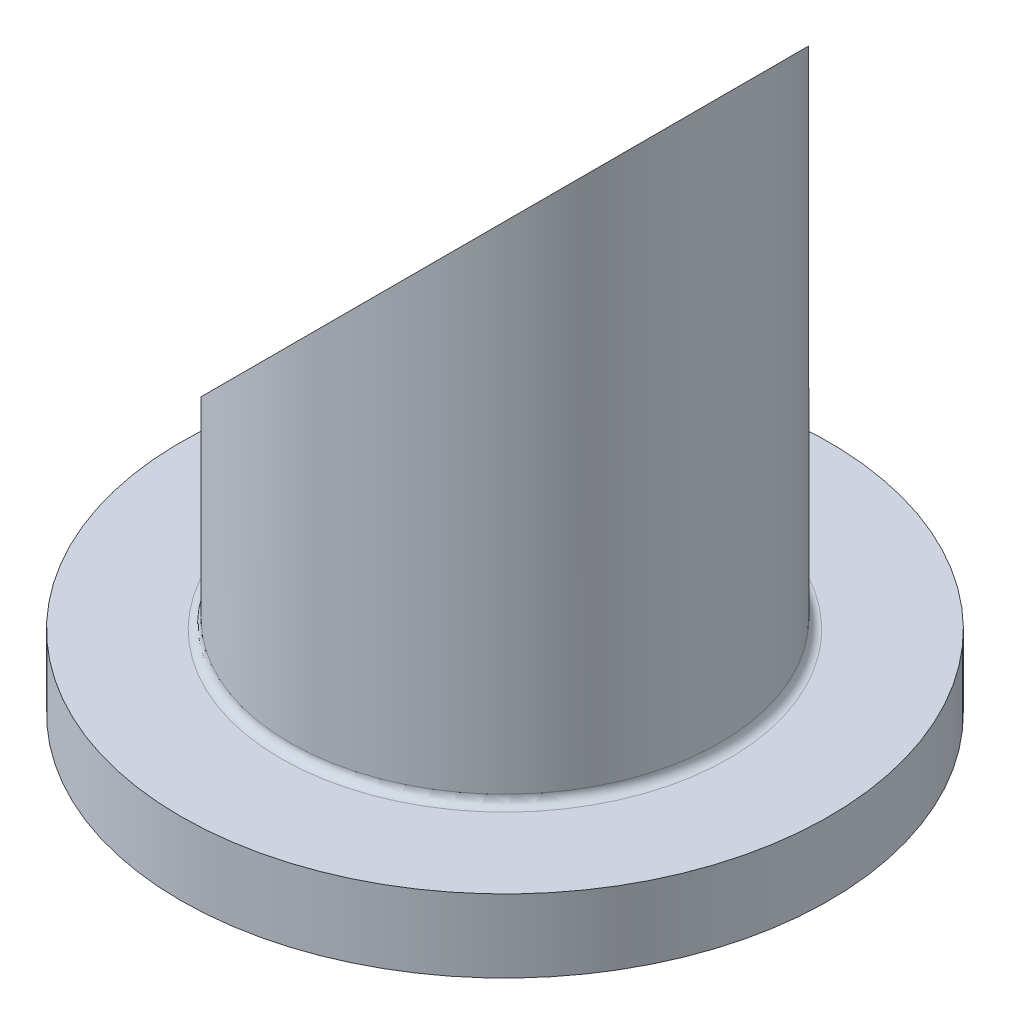
ISO-10303-21;
HEADER;
FILE_DESCRIPTION(('STEP AP214'),'2;1');
FILE_NAME('part.step','',(''),(''),'','','');
FILE_SCHEMA(('AUTOMOTIVE_DESIGN { 1 0 10303 214 1 1 1 1 }'));
ENDSEC;
DATA;
#1=APPLICATION_CONTEXT('core data for automotive mechanical design processes');
#2=APPLICATION_PROTOCOL_DEFINITION('international standard','automotive_design',2000,#1);
#3=PRODUCT_CONTEXT('',#1,'mechanical');
#4=PRODUCT('Part','Part','',(#3));
#5=PRODUCT_RELATED_PRODUCT_CATEGORY('part','',(#4));
#6=PRODUCT_DEFINITION_FORMATION('','',#4);
#7=PRODUCT_DEFINITION_CONTEXT('part definition',#1,'design');
#8=PRODUCT_DEFINITION('design','',#6,#7);
#9=PRODUCT_DEFINITION_SHAPE('','',#8);
#10=(LENGTH_UNIT() NAMED_UNIT(*) SI_UNIT(.MILLI.,.METRE.));
#11=(NAMED_UNIT(*) PLANE_ANGLE_UNIT() SI_UNIT($,.RADIAN.));
#12=(NAMED_UNIT(*) SI_UNIT($,.STERADIAN.) SOLID_ANGLE_UNIT());
#13=UNCERTAINTY_MEASURE_WITH_UNIT(LENGTH_MEASURE(1.E-05),#10,'distance_accuracy_value','');
#14=(GEOMETRIC_REPRESENTATION_CONTEXT(3) GLOBAL_UNCERTAINTY_ASSIGNED_CONTEXT((#13)) GLOBAL_UNIT_ASSIGNED_CONTEXT((#10,
#11,#12)) REPRESENTATION_CONTEXT('',''));
#15=CARTESIAN_POINT('',(0.,0.,0.));
#16=DIRECTION('',(0.,0.,1.));
#17=DIRECTION('',(1.,0.,0.));
#18=AXIS2_PLACEMENT_3D('',#15,#16,#17);
#19=CARTESIAN_POINT('',(0.,0.,0.));
#20=DIRECTION('',(0.,1.,0.));
#21=DIRECTION('',(0.,0.,1.));
#22=AXIS2_PLACEMENT_3D('',#19,#20,#21);
#23=PLANE('',#22);
#24=CARTESIAN_POINT('',(0.,0.,0.));
#25=DIRECTION('',(0.,1.,0.));
#26=DIRECTION('',(0.,0.,1.));
#27=AXIS2_PLACEMENT_3D('',#24,#25,#26);
#28=CIRCLE('',#27,8.90000000000001);
#29=CARTESIAN_POINT('',(0.,0.,8.90000000000001));
#30=VERTEX_POINT('',#29);
#31=EDGE_CURVE('E447',#30,#30,#28,.T.);
#32=ORIENTED_EDGE('',*,*,#31,.F.);
#33=EDGE_LOOP('',(#32));
#34=FACE_BOUND('',#33,.T.);
#35=CARTESIAN_POINT('',(4.75,0.,-0.25));
#36=DIRECTION('',(0.,1.,0.));
#37=DIRECTION('',(0.,0.,1.));
#38=AXIS2_PLACEMENT_3D('',#35,#36,#37);
#39=CIRCLE('',#38,0.5);
#40=CARTESIAN_POINT('',(4.75,0.,-0.75));
#41=VERTEX_POINT('',#40);
#42=CARTESIAN_POINT('',(5.25,0.,-0.25));
#43=VERTEX_POINT('',#42);
#44=EDGE_CURVE('E192',#41,#43,#39,.F.);
#45=ORIENTED_EDGE('',*,*,#44,.F.);
#46=DIRECTION('',(1.,0.,0.));
#47=VECTOR('',#46,1.);
#48=CARTESIAN_POINT('',(0.,0.,-0.75));
#49=LINE('',#48,#47);
#50=CARTESIAN_POINT('',(3.25,0.,-0.75));
#51=VERTEX_POINT('',#50);
#52=EDGE_CURVE('E142',#41,#51,#49,.F.);
#53=ORIENTED_EDGE('',*,*,#52,.T.);
#54=CARTESIAN_POINT('',(3.25,0.,-0.25));
#55=DIRECTION('',(0.,1.,0.));
#56=DIRECTION('',(0.,0.,1.));
#57=AXIS2_PLACEMENT_3D('',#54,#55,#56);
#58=CIRCLE('',#57,0.5);
#59=CARTESIAN_POINT('',(2.75,0.,-0.25));
#60=VERTEX_POINT('',#59);
#61=EDGE_CURVE('E188',#60,#51,#58,.F.);
#62=ORIENTED_EDGE('',*,*,#61,.F.);
#63=DIRECTION('',(0.,0.,-1.));
#64=VECTOR('',#63,1.);
#65=CARTESIAN_POINT('',(2.75,0.,0.));
#66=LINE('',#65,#64);
#67=CARTESIAN_POINT('',(2.75,0.,0.25));
#68=VERTEX_POINT('',#67);
#69=EDGE_CURVE('E184',#60,#68,#66,.F.);
#70=ORIENTED_EDGE('',*,*,#69,.T.);
#71=CARTESIAN_POINT('',(3.25,0.,0.25));
#72=DIRECTION('',(0.,1.,0.));
#73=DIRECTION('',(0.,0.,1.));
#74=AXIS2_PLACEMENT_3D('',#71,#72,#73);
#75=CIRCLE('',#74,0.5);
#76=CARTESIAN_POINT('',(3.25,0.,0.75));
#77=VERTEX_POINT('',#76);
#78=EDGE_CURVE('E181',#77,#68,#75,.F.);
#79=ORIENTED_EDGE('',*,*,#78,.F.);
#80=DIRECTION('',(-1.,0.,0.));
#81=VECTOR('',#80,1.);
#82=CARTESIAN_POINT('',(0.,0.,0.75));
#83=LINE('',#82,#81);
#84=CARTESIAN_POINT('',(4.75,0.,0.75));
#85=VERTEX_POINT('',#84);
#86=EDGE_CURVE('E179',#77,#85,#83,.F.);
#87=ORIENTED_EDGE('',*,*,#86,.T.);
#88=CARTESIAN_POINT('',(4.75,0.,0.25));
#89=DIRECTION('',(0.,1.,0.));
#90=DIRECTION('',(0.,0.,1.));
#91=AXIS2_PLACEMENT_3D('',#88,#89,#90);
#92=CIRCLE('',#91,0.5);
#93=CARTESIAN_POINT('',(5.25,0.,0.25));
#94=VERTEX_POINT('',#93);
#95=EDGE_CURVE('E173',#94,#85,#92,.F.);
#96=ORIENTED_EDGE('',*,*,#95,.F.);
#97=DIRECTION('',(0.,0.,1.));
#98=VECTOR('',#97,1.);
#99=CARTESIAN_POINT('',(5.25,0.,0.));
#100=LINE('',#99,#98);
#101=EDGE_CURVE('E186',#94,#43,#100,.F.);
#102=ORIENTED_EDGE('',*,*,#101,.T.);
#103=EDGE_LOOP('',(#45,#53,#62,#70,#79,#87,#96,#102));
#104=FACE_BOUND('',#103,.T.);
#105=ADVANCED_FACE('F35',(#34,#104),#23,.F.);
#106=CARTESIAN_POINT('',(0.,2.,0.));
#107=DIRECTION('',(0.,-1.,0.));
#108=DIRECTION('',(0.,0.,-1.));
#109=AXIS2_PLACEMENT_3D('',#106,#107,#108);
#110=CYLINDRICAL_SURFACE('',#109,8.90000000000001);
#111=CARTESIAN_POINT('',(0.,2.,0.));
#112=DIRECTION('',(0.,1.,0.));
#113=DIRECTION('',(0.,0.,1.));
#114=AXIS2_PLACEMENT_3D('',#111,#112,#113);
#115=CIRCLE('',#114,8.90000000000001);
#116=CARTESIAN_POINT('',(0.,2.,8.90000000000001));
#117=VERTEX_POINT('',#116);
#118=EDGE_CURVE('E166',#117,#117,#115,.T.);
#119=ORIENTED_EDGE('',*,*,#118,.F.);
#120=EDGE_LOOP('',(#119));
#121=FACE_BOUND('',#120,.T.);
#122=ORIENTED_EDGE('',*,*,#31,.T.);
#123=EDGE_LOOP('',(#122));
#124=FACE_BOUND('',#123,.T.);
#125=ADVANCED_FACE('F298',(#121,#124),#110,.T.);
#126=CARTESIAN_POINT('',(0.,2.,0.));
#127=DIRECTION('',(0.,1.,0.));
#128=DIRECTION('',(0.,0.,1.));
#129=AXIS2_PLACEMENT_3D('',#126,#127,#128);
#130=PLANE('',#129);
#131=CARTESIAN_POINT('',(0.,2.,0.));
#132=DIRECTION('',(0.,1.,0.));
#133=DIRECTION('',(0.,0.,1.));
#134=AXIS2_PLACEMENT_3D('',#131,#132,#133);
#135=CIRCLE('',#134,6.15);
#136=CARTESIAN_POINT('',(0.,2.,6.15));
#137=VERTEX_POINT('',#136);
#138=EDGE_CURVE('E11',#137,#137,#135,.F.);
#139=ORIENTED_EDGE('',*,*,#138,.T.);
#140=EDGE_LOOP('',(#139));
#141=FACE_BOUND('',#140,.T.);
#142=ORIENTED_EDGE('',*,*,#118,.T.);
#143=EDGE_LOOP('',(#142));
#144=FACE_BOUND('',#143,.T.);
#145=ADVANCED_FACE('F304',(#141,#144),#130,.T.);
#146=CARTESIAN_POINT('',(0.,22.,0.));
#147=DIRECTION('',(0.,-1.,0.));
#148=DIRECTION('',(0.,0.,-1.));
#149=AXIS2_PLACEMENT_3D('',#146,#147,#148);
#150=CYLINDRICAL_SURFACE('',#149,5.9);
#151=CARTESIAN_POINT('',(0.,2.25,0.));
#152=DIRECTION('',(0.,1.,0.));
#153=DIRECTION('',(0.,0.,1.));
#154=AXIS2_PLACEMENT_3D('',#151,#152,#153);
#155=CIRCLE('',#154,5.9);
#156=CARTESIAN_POINT('',(0.,2.25,5.9));
#157=VERTEX_POINT('',#156);
#158=EDGE_CURVE('E43',#157,#157,#155,.T.);
#159=ORIENTED_EDGE('',*,*,#158,.T.);
#160=EDGE_LOOP('',(#159));
#161=FACE_BOUND('',#160,.T.);
#162=CARTESIAN_POINT('',(0.,11.7,0.));
#163=DIRECTION('',(0.707106781186548,-0.707106781186547,0.));
#164=DIRECTION('',(-0.707106781186547,-0.707106781186548,0.));
#165=AXIS2_PLACEMENT_3D('',#162,#163,#164);
#166=ELLIPSE('',#165,8.34386001800126,5.9);
#167=CARTESIAN_POINT('',(-5.9,5.79999999999999,0.));
#168=VERTEX_POINT('',#167);
#169=EDGE_CURVE('E283',#168,#168,#166,.T.);
#170=ORIENTED_EDGE('',*,*,#169,.T.);
#171=EDGE_LOOP('',(#170));
#172=FACE_BOUND('',#171,.T.);
#173=ADVANCED_FACE('F287',(#161,#172),#150,.T.);
#174=CARTESIAN_POINT('',(-5.85,5.85,-8.90000000000001));
#175=DIRECTION('',(0.707106781186548,-0.707106781186547,0.));
#176=DIRECTION('',(0.707106781186547,0.707106781186548,0.));
#177=AXIS2_PLACEMENT_3D('',#174,#175,#176);
#178=PLANE('',#177);
#179=ORIENTED_EDGE('',*,*,#169,.F.);
#180=EDGE_LOOP('',(#179));
#181=FACE_BOUND('',#180,.T.);
#182=ADVANCED_FACE('F426',(#181),#178,.F.);
#183=CARTESIAN_POINT('',(3.,1.2,0.5));
#184=DIRECTION('',(-1.,0.,0.));
#185=DIRECTION('',(0.,0.,1.));
#186=AXIS2_PLACEMENT_3D('',#183,#184,#185);
#187=PLANE('',#186);
#188=DIRECTION('',(0.,0.,-1.));
#189=VECTOR('',#188,1.);
#190=CARTESIAN_POINT('',(3.,0.25,0.5));
#191=LINE('',#190,#189);
#192=CARTESIAN_POINT('',(3.,0.25,0.25));
#193=VERTEX_POINT('',#192);
#194=CARTESIAN_POINT('',(3.,0.25,-0.25));
#195=VERTEX_POINT('',#194);
#196=EDGE_CURVE('E207',#193,#195,#191,.T.);
#197=ORIENTED_EDGE('',*,*,#196,.T.);
#198=DIRECTION('',(0.,-1.,0.));
#199=VECTOR('',#198,1.);
#200=CARTESIAN_POINT('',(3.,1.2,-0.25));
#201=LINE('',#200,#199);
#202=CARTESIAN_POINT('',(3.,0.95,-0.25));
#203=VERTEX_POINT('',#202);
#204=EDGE_CURVE('E210',#195,#203,#201,.F.);
#205=ORIENTED_EDGE('',*,*,#204,.T.);
#206=DIRECTION('',(0.,0.,-1.));
#207=VECTOR('',#206,1.);
#208=CARTESIAN_POINT('',(3.,0.95,0.5));
#209=LINE('',#208,#207);
#210=CARTESIAN_POINT('',(3.,0.95,0.25));
#211=VERTEX_POINT('',#210);
#212=EDGE_CURVE('E205',#203,#211,#209,.F.);
#213=ORIENTED_EDGE('',*,*,#212,.T.);
#214=DIRECTION('',(0.,-1.,0.));
#215=VECTOR('',#214,1.);
#216=CARTESIAN_POINT('',(3.,0.,0.25));
#217=LINE('',#216,#215);
#218=EDGE_CURVE('E203',#211,#193,#217,.T.);
#219=ORIENTED_EDGE('',*,*,#218,.T.);
#220=EDGE_LOOP('',(#197,#205,#213,#219));
#221=FACE_BOUND('',#220,.T.);
#222=ADVANCED_FACE('F424',(#221),#187,.F.);
#223=CARTESIAN_POINT('',(3.,1.2,0.5));
#224=DIRECTION('',(0.,0.,1.));
#225=DIRECTION('',(1.,0.,0.));
#226=AXIS2_PLACEMENT_3D('',#223,#224,#225);
#227=PLANE('',#226);
#228=DIRECTION('',(-1.,0.,0.));
#229=VECTOR('',#228,1.);
#230=CARTESIAN_POINT('',(3.,0.25,0.5));
#231=LINE('',#230,#229);
#232=CARTESIAN_POINT('',(4.75,0.25,0.5));
#233=VERTEX_POINT('',#232);
#234=CARTESIAN_POINT('',(3.25,0.25,0.5));
#235=VERTEX_POINT('',#234);
#236=EDGE_CURVE('E55',#233,#235,#231,.T.);
#237=ORIENTED_EDGE('',*,*,#236,.T.);
#238=DIRECTION('',(0.,-1.,0.));
#239=VECTOR('',#238,1.);
#240=CARTESIAN_POINT('',(3.25,1.2,0.5));
#241=LINE('',#240,#239);
#242=CARTESIAN_POINT('',(3.25,0.95,0.5));
#243=VERTEX_POINT('',#242);
#244=EDGE_CURVE('E50',#235,#243,#241,.F.);
#245=ORIENTED_EDGE('',*,*,#244,.T.);
#246=DIRECTION('',(-1.,0.,0.));
#247=VECTOR('',#246,1.);
#248=CARTESIAN_POINT('',(3.,0.95,0.5));
#249=LINE('',#248,#247);
#250=CARTESIAN_POINT('',(4.75,0.95,0.5));
#251=VERTEX_POINT('',#250);
#252=EDGE_CURVE('E224',#243,#251,#249,.F.);
#253=ORIENTED_EDGE('',*,*,#252,.T.);
#254=DIRECTION('',(0.,-1.,0.));
#255=VECTOR('',#254,1.);
#256=CARTESIAN_POINT('',(4.75,0.,0.5));
#257=LINE('',#256,#255);
#258=EDGE_CURVE('E221',#251,#233,#257,.T.);
#259=ORIENTED_EDGE('',*,*,#258,.T.);
#260=EDGE_LOOP('',(#237,#245,#253,#259));
#261=FACE_BOUND('',#260,.T.);
#262=ADVANCED_FACE('F410',(#261),#227,.F.);
#263=CARTESIAN_POINT('',(5.,1.2,0.5));
#264=DIRECTION('',(1.,0.,0.));
#265=DIRECTION('',(0.,0.,-1.));
#266=AXIS2_PLACEMENT_3D('',#263,#264,#265);
#267=PLANE('',#266);
#268=DIRECTION('',(0.,0.,1.));
#269=VECTOR('',#268,1.);
#270=CARTESIAN_POINT('',(5.,0.95,0.5));
#271=LINE('',#270,#269);
#272=CARTESIAN_POINT('',(5.,0.95,0.25));
#273=VERTEX_POINT('',#272);
#274=CARTESIAN_POINT('',(5.,0.95,-0.25));
#275=VERTEX_POINT('',#274);
#276=EDGE_CURVE('E196',#273,#275,#271,.F.);
#277=ORIENTED_EDGE('',*,*,#276,.T.);
#278=DIRECTION('',(0.,-1.,0.));
#279=VECTOR('',#278,1.);
#280=CARTESIAN_POINT('',(5.,0.,-0.25));
#281=LINE('',#280,#279);
#282=CARTESIAN_POINT('',(5.,0.25,-0.25));
#283=VERTEX_POINT('',#282);
#284=EDGE_CURVE('E201',#275,#283,#281,.T.);
#285=ORIENTED_EDGE('',*,*,#284,.T.);
#286=DIRECTION('',(0.,0.,1.));
#287=VECTOR('',#286,1.);
#288=CARTESIAN_POINT('',(5.,0.25,0.5));
#289=LINE('',#288,#287);
#290=CARTESIAN_POINT('',(5.,0.25,0.25));
#291=VERTEX_POINT('',#290);
#292=EDGE_CURVE('E198',#283,#291,#289,.T.);
#293=ORIENTED_EDGE('',*,*,#292,.T.);
#294=DIRECTION('',(0.,-1.,0.));
#295=VECTOR('',#294,1.);
#296=CARTESIAN_POINT('',(5.,1.2,0.25));
#297=LINE('',#296,#295);
#298=EDGE_CURVE('E194',#291,#273,#297,.F.);
#299=ORIENTED_EDGE('',*,*,#298,.T.);
#300=EDGE_LOOP('',(#277,#285,#293,#299));
#301=FACE_BOUND('',#300,.T.);
#302=ADVANCED_FACE('F403',(#301),#267,.F.);
#303=CARTESIAN_POINT('',(3.,1.2,-0.5));
#304=DIRECTION('',(0.,0.,-1.));
#305=DIRECTION('',(-1.,0.,0.));
#306=AXIS2_PLACEMENT_3D('',#303,#304,#305);
#307=PLANE('',#306);
#308=DIRECTION('',(1.,0.,0.));
#309=VECTOR('',#308,1.);
#310=CARTESIAN_POINT('',(3.,0.95,-0.5));
#311=LINE('',#310,#309);
#312=CARTESIAN_POINT('',(4.75,0.95,-0.5));
#313=VERTEX_POINT('',#312);
#314=CARTESIAN_POINT('',(3.25,0.95,-0.5));
#315=VERTEX_POINT('',#314);
#316=EDGE_CURVE('E165',#313,#315,#311,.F.);
#317=ORIENTED_EDGE('',*,*,#316,.T.);
#318=DIRECTION('',(0.,-1.,0.));
#319=VECTOR('',#318,1.);
#320=CARTESIAN_POINT('',(3.25,0.,-0.5));
#321=LINE('',#320,#319);
#322=CARTESIAN_POINT('',(3.25,0.25,-0.5));
#323=VERTEX_POINT('',#322);
#324=EDGE_CURVE('E170',#315,#323,#321,.T.);
#325=ORIENTED_EDGE('',*,*,#324,.T.);
#326=DIRECTION('',(1.,0.,0.));
#327=VECTOR('',#326,1.);
#328=CARTESIAN_POINT('',(3.,0.25,-0.5));
#329=LINE('',#328,#327);
#330=CARTESIAN_POINT('',(4.75,0.25,-0.5));
#331=VERTEX_POINT('',#330);
#332=EDGE_CURVE('E140',#323,#331,#329,.T.);
#333=ORIENTED_EDGE('',*,*,#332,.T.);
#334=DIRECTION('',(0.,-1.,0.));
#335=VECTOR('',#334,1.);
#336=CARTESIAN_POINT('',(4.75,1.2,-0.5));
#337=LINE('',#336,#335);
#338=EDGE_CURVE('E159',#331,#313,#337,.F.);
#339=ORIENTED_EDGE('',*,*,#338,.T.);
#340=EDGE_LOOP('',(#317,#325,#333,#339));
#341=FACE_BOUND('',#340,.T.);
#342=ADVANCED_FACE('F168',(#341),#307,.F.);
#343=CARTESIAN_POINT('',(0.,1.2,0.));
#344=DIRECTION('',(0.,-1.,0.));
#345=DIRECTION('',(0.,0.,-1.));
#346=AXIS2_PLACEMENT_3D('',#343,#344,#345);
#347=PLANE('',#346);
#348=DIRECTION('',(0.,0.,1.));
#349=VECTOR('',#348,1.);
#350=CARTESIAN_POINT('',(4.75,1.2,0.));
#351=LINE('',#350,#349);
#352=CARTESIAN_POINT('',(4.75,1.2,-0.25));
#353=VERTEX_POINT('',#352);
#354=CARTESIAN_POINT('',(4.75,1.2,0.25));
#355=VERTEX_POINT('',#354);
#356=EDGE_CURVE('E216',#353,#355,#351,.T.);
#357=ORIENTED_EDGE('',*,*,#356,.T.);
#358=DIRECTION('',(-1.,0.,0.));
#359=VECTOR('',#358,1.);
#360=CARTESIAN_POINT('',(0.,1.2,0.25));
#361=LINE('',#360,#359);
#362=CARTESIAN_POINT('',(3.25,1.2,0.25));
#363=VERTEX_POINT('',#362);
#364=EDGE_CURVE('E218',#355,#363,#361,.T.);
#365=ORIENTED_EDGE('',*,*,#364,.T.);
#366=DIRECTION('',(0.,0.,-1.));
#367=VECTOR('',#366,1.);
#368=CARTESIAN_POINT('',(3.25,1.2,0.));
#369=LINE('',#368,#367);
#370=CARTESIAN_POINT('',(3.25,1.2,-0.25));
#371=VERTEX_POINT('',#370);
#372=EDGE_CURVE('E212',#363,#371,#369,.T.);
#373=ORIENTED_EDGE('',*,*,#372,.T.);
#374=DIRECTION('',(1.,0.,0.));
#375=VECTOR('',#374,1.);
#376=CARTESIAN_POINT('',(0.,1.2,-0.25));
#377=LINE('',#376,#375);
#378=EDGE_CURVE('E214',#371,#353,#377,.T.);
#379=ORIENTED_EDGE('',*,*,#378,.T.);
#380=EDGE_LOOP('',(#357,#365,#373,#379));
#381=FACE_BOUND('',#380,.T.);
#382=ADVANCED_FACE('F381',(#381),#347,.T.);
#383=CARTESIAN_POINT('',(0.,0.95,0.25));
#384=DIRECTION('',(-1.,0.,0.));
#385=DIRECTION('',(0.,0.,1.));
#386=AXIS2_PLACEMENT_3D('',#383,#384,#385);
#387=CYLINDRICAL_SURFACE('',#386,0.25);
#388=CARTESIAN_POINT('',(3.25,0.95,0.25));
#389=DIRECTION('',(1.,0.,0.));
#390=DIRECTION('',(0.,0.,-1.));
#391=AXIS2_PLACEMENT_3D('',#388,#389,#390);
#392=CIRCLE('',#391,0.25);
#393=EDGE_CURVE('E281',#363,#243,#392,.T.);
#394=ORIENTED_EDGE('',*,*,#393,.F.);
#395=ORIENTED_EDGE('',*,*,#364,.F.);
#396=CARTESIAN_POINT('',(4.75,0.95,0.25));
#397=DIRECTION('',(-1.,0.,0.));
#398=DIRECTION('',(0.,0.,1.));
#399=AXIS2_PLACEMENT_3D('',#396,#397,#398);
#400=CIRCLE('',#399,0.25);
#401=EDGE_CURVE('E278',#251,#355,#400,.T.);
#402=ORIENTED_EDGE('',*,*,#401,.F.);
#403=ORIENTED_EDGE('',*,*,#252,.F.);
#404=EDGE_LOOP('',(#394,#395,#402,#403));
#405=FACE_BOUND('',#404,.T.);
#406=ADVANCED_FACE('F378',(#405),#387,.F.);
#407=CARTESIAN_POINT('',(3.25,0.95,0.25));
#408=DIRECTION('',(0.,0.,1.));
#409=DIRECTION('',(1.,0.,0.));
#410=AXIS2_PLACEMENT_3D('',#407,#408,#409);
#411=SPHERICAL_SURFACE('',#410,0.25);
#412=CARTESIAN_POINT('',(3.25,0.95,0.25));
#413=DIRECTION('',(0.,0.,-1.));
#414=DIRECTION('',(-1.,0.,0.));
#415=AXIS2_PLACEMENT_3D('',#412,#413,#414);
#416=CIRCLE('',#415,0.25);
#417=EDGE_CURVE('E272',#363,#211,#416,.F.);
#418=ORIENTED_EDGE('',*,*,#417,.F.);
#419=ORIENTED_EDGE('',*,*,#393,.T.);
#420=CARTESIAN_POINT('',(3.25,0.95,0.25));
#421=DIRECTION('',(0.,-1.,0.));
#422=DIRECTION('',(0.,0.,-1.));
#423=AXIS2_PLACEMENT_3D('',#420,#421,#422);
#424=CIRCLE('',#423,0.25);
#425=EDGE_CURVE('E275',#211,#243,#424,.F.);
#426=ORIENTED_EDGE('',*,*,#425,.F.);
#427=EDGE_LOOP('',(#418,#419,#426));
#428=FACE_BOUND('',#427,.T.);
#429=ADVANCED_FACE('F375',(#428),#411,.F.);
#430=CARTESIAN_POINT('',(4.75,0.95,0.25));
#431=DIRECTION('',(0.,0.,1.));
#432=DIRECTION('',(1.,0.,0.));
#433=AXIS2_PLACEMENT_3D('',#430,#431,#432);
#434=SPHERICAL_SURFACE('',#433,0.25);
#435=CARTESIAN_POINT('',(4.75,0.95,0.25));
#436=DIRECTION('',(0.,-1.,0.));
#437=DIRECTION('',(0.,0.,-1.));
#438=AXIS2_PLACEMENT_3D('',#435,#436,#437);
#439=CIRCLE('',#438,0.25);
#440=EDGE_CURVE('E266',#251,#273,#439,.F.);
#441=ORIENTED_EDGE('',*,*,#440,.F.);
#442=ORIENTED_EDGE('',*,*,#401,.T.);
#443=CARTESIAN_POINT('',(4.75,0.95,0.25));
#444=DIRECTION('',(0.,0.,-1.));
#445=DIRECTION('',(-1.,0.,0.));
#446=AXIS2_PLACEMENT_3D('',#443,#444,#445);
#447=CIRCLE('',#446,0.25);
#448=EDGE_CURVE('E269',#273,#355,#447,.F.);
#449=ORIENTED_EDGE('',*,*,#448,.F.);
#450=EDGE_LOOP('',(#441,#442,#449));
#451=FACE_BOUND('',#450,.T.);
#452=ADVANCED_FACE('F371',(#451),#434,.F.);
#453=CARTESIAN_POINT('',(3.25,1.2,0.25));
#454=DIRECTION('',(0.,1.,0.));
#455=DIRECTION('',(0.,0.,1.));
#456=AXIS2_PLACEMENT_3D('',#453,#454,#455);
#457=CYLINDRICAL_SURFACE('',#456,0.25);
#458=ORIENTED_EDGE('',*,*,#425,.T.);
#459=ORIENTED_EDGE('',*,*,#244,.F.);
#460=CARTESIAN_POINT('',(3.25,0.25,0.25));
#461=DIRECTION('',(0.,1.,0.));
#462=DIRECTION('',(0.,0.,1.));
#463=AXIS2_PLACEMENT_3D('',#460,#461,#462);
#464=CIRCLE('',#463,0.25);
#465=EDGE_CURVE('E260',#193,#235,#464,.T.);
#466=ORIENTED_EDGE('',*,*,#465,.F.);
#467=ORIENTED_EDGE('',*,*,#218,.F.);
#468=EDGE_LOOP('',(#458,#459,#466,#467));
#469=FACE_BOUND('',#468,.T.);
#470=ADVANCED_FACE('F367',(#469),#457,.F.);
#471=CARTESIAN_POINT('',(3.25,0.95,0.));
#472=DIRECTION('',(0.,0.,-1.));
#473=DIRECTION('',(-1.,0.,0.));
#474=AXIS2_PLACEMENT_3D('',#471,#472,#473);
#475=CYLINDRICAL_SURFACE('',#474,0.25);
#476=ORIENTED_EDGE('',*,*,#417,.T.);
#477=ORIENTED_EDGE('',*,*,#212,.F.);
#478=CARTESIAN_POINT('',(3.25,0.95,-0.25));
#479=DIRECTION('',(0.,0.,1.));
#480=DIRECTION('',(1.,0.,0.));
#481=AXIS2_PLACEMENT_3D('',#478,#479,#480);
#482=CIRCLE('',#481,0.25);
#483=EDGE_CURVE('E257',#371,#203,#482,.T.);
#484=ORIENTED_EDGE('',*,*,#483,.F.);
#485=ORIENTED_EDGE('',*,*,#372,.F.);
#486=EDGE_LOOP('',(#476,#477,#484,#485));
#487=FACE_BOUND('',#486,.T.);
#488=ADVANCED_FACE('F363',(#487),#475,.F.);
#489=CARTESIAN_POINT('',(0.,0.95,-0.25));
#490=DIRECTION('',(1.,0.,0.));
#491=DIRECTION('',(0.,0.,-1.));
#492=AXIS2_PLACEMENT_3D('',#489,#490,#491);
#493=CYLINDRICAL_SURFACE('',#492,0.25);
#494=CARTESIAN_POINT('',(4.75,0.95,-0.25));
#495=DIRECTION('',(-1.,0.,0.));
#496=DIRECTION('',(0.,0.,1.));
#497=AXIS2_PLACEMENT_3D('',#494,#495,#496);
#498=CIRCLE('',#497,0.25);
#499=EDGE_CURVE('E251',#353,#313,#498,.T.);
#500=ORIENTED_EDGE('',*,*,#499,.F.);
#501=ORIENTED_EDGE('',*,*,#378,.F.);
#502=CARTESIAN_POINT('',(3.25,0.95,-0.25));
#503=DIRECTION('',(1.,0.,0.));
#504=DIRECTION('',(0.,0.,-1.));
#505=AXIS2_PLACEMENT_3D('',#502,#503,#504);
#506=CIRCLE('',#505,0.25);
#507=EDGE_CURVE('E254',#315,#371,#506,.T.);
#508=ORIENTED_EDGE('',*,*,#507,.F.);
#509=ORIENTED_EDGE('',*,*,#316,.F.);
#510=EDGE_LOOP('',(#500,#501,#508,#509));
#511=FACE_BOUND('',#510,.T.);
#512=ADVANCED_FACE('F359',(#511),#493,.F.);
#513=CARTESIAN_POINT('',(4.75,0.95,0.));
#514=DIRECTION('',(0.,0.,1.));
#515=DIRECTION('',(1.,0.,0.));
#516=AXIS2_PLACEMENT_3D('',#513,#514,#515);
#517=CYLINDRICAL_SURFACE('',#516,0.25);
#518=ORIENTED_EDGE('',*,*,#448,.T.);
#519=ORIENTED_EDGE('',*,*,#356,.F.);
#520=CARTESIAN_POINT('',(4.75,0.95,-0.25));
#521=DIRECTION('',(0.,0.,1.));
#522=DIRECTION('',(1.,0.,0.));
#523=AXIS2_PLACEMENT_3D('',#520,#521,#522);
#524=CIRCLE('',#523,0.25);
#525=EDGE_CURVE('E248',#275,#353,#524,.T.);
#526=ORIENTED_EDGE('',*,*,#525,.F.);
#527=ORIENTED_EDGE('',*,*,#276,.F.);
#528=EDGE_LOOP('',(#518,#519,#526,#527));
#529=FACE_BOUND('',#528,.T.);
#530=ADVANCED_FACE('F355',(#529),#517,.F.);
#531=CARTESIAN_POINT('',(4.75,1.2,0.25));
#532=DIRECTION('',(0.,1.,0.));
#533=DIRECTION('',(0.,0.,1.));
#534=AXIS2_PLACEMENT_3D('',#531,#532,#533);
#535=CYLINDRICAL_SURFACE('',#534,0.25);
#536=ORIENTED_EDGE('',*,*,#440,.T.);
#537=ORIENTED_EDGE('',*,*,#298,.F.);
#538=CARTESIAN_POINT('',(4.75,0.25,0.25));
#539=DIRECTION('',(0.,1.,0.));
#540=DIRECTION('',(0.,0.,1.));
#541=AXIS2_PLACEMENT_3D('',#538,#539,#540);
#542=CIRCLE('',#541,0.25);
#543=EDGE_CURVE('E245',#233,#291,#542,.T.);
#544=ORIENTED_EDGE('',*,*,#543,.F.);
#545=ORIENTED_EDGE('',*,*,#258,.F.);
#546=EDGE_LOOP('',(#536,#537,#544,#545));
#547=FACE_BOUND('',#546,.T.);
#548=ADVANCED_FACE('F351',(#547),#535,.F.);
#549=CARTESIAN_POINT('',(3.,0.25,0.75));
#550=DIRECTION('',(-1.,0.,0.));
#551=DIRECTION('',(0.,0.,1.));
#552=AXIS2_PLACEMENT_3D('',#549,#550,#551);
#553=CYLINDRICAL_SURFACE('',#552,0.25);
#554=CARTESIAN_POINT('',(4.75,0.25,0.75));
#555=DIRECTION('',(1.,0.,0.));
#556=DIRECTION('',(0.,0.,-1.));
#557=AXIS2_PLACEMENT_3D('',#554,#555,#556);
#558=CIRCLE('',#557,0.25);
#559=EDGE_CURVE('E242',#85,#233,#558,.T.);
#560=ORIENTED_EDGE('',*,*,#559,.F.);
#561=ORIENTED_EDGE('',*,*,#86,.F.);
#562=CARTESIAN_POINT('',(3.25,0.25,0.75));
#563=DIRECTION('',(-1.,0.,0.));
#564=DIRECTION('',(0.,0.,1.));
#565=AXIS2_PLACEMENT_3D('',#562,#563,#564);
#566=CIRCLE('',#565,0.25);
#567=EDGE_CURVE('E263',#235,#77,#566,.T.);
#568=ORIENTED_EDGE('',*,*,#567,.F.);
#569=ORIENTED_EDGE('',*,*,#236,.F.);
#570=EDGE_LOOP('',(#560,#561,#568,#569));
#571=FACE_BOUND('',#570,.T.);
#572=ADVANCED_FACE('F347',(#571),#553,.T.);
#573=CARTESIAN_POINT('',(3.25,0.25,0.25));
#574=DIRECTION('',(0.,1.,0.));
#575=DIRECTION('',(0.,0.,1.));
#576=AXIS2_PLACEMENT_3D('',#573,#574,#575);
#577=TOROIDAL_SURFACE('',#576,0.5,0.25);
#578=ORIENTED_EDGE('',*,*,#567,.T.);
#579=ORIENTED_EDGE('',*,*,#78,.T.);
#580=CARTESIAN_POINT('',(2.75,0.25,0.25));
#581=DIRECTION('',(0.,0.,1.));
#582=DIRECTION('',(1.,0.,0.));
#583=AXIS2_PLACEMENT_3D('',#580,#581,#582);
#584=CIRCLE('',#583,0.25);
#585=EDGE_CURVE('E239',#193,#68,#584,.F.);
#586=ORIENTED_EDGE('',*,*,#585,.F.);
#587=ORIENTED_EDGE('',*,*,#465,.T.);
#588=EDGE_LOOP('',(#578,#579,#586,#587));
#589=FACE_BOUND('',#588,.T.);
#590=ADVANCED_FACE('F343',(#589),#577,.T.);
#591=CARTESIAN_POINT('',(3.25,0.95,-0.25));
#592=DIRECTION('',(0.,0.,1.));
#593=DIRECTION('',(1.,0.,0.));
#594=AXIS2_PLACEMENT_3D('',#591,#592,#593);
#595=SPHERICAL_SURFACE('',#594,0.25);
#596=ORIENTED_EDGE('',*,*,#507,.T.);
#597=ORIENTED_EDGE('',*,*,#483,.T.);
#598=CARTESIAN_POINT('',(3.25,0.95,-0.25));
#599=DIRECTION('',(0.,-1.,0.));
#600=DIRECTION('',(0.,0.,-1.));
#601=AXIS2_PLACEMENT_3D('',#598,#599,#600);
#602=CIRCLE('',#601,0.25);
#603=EDGE_CURVE('E236',#315,#203,#602,.F.);
#604=ORIENTED_EDGE('',*,*,#603,.F.);
#605=EDGE_LOOP('',(#596,#597,#604));
#606=FACE_BOUND('',#605,.T.);
#607=ADVANCED_FACE('F339',(#606),#595,.F.);
#608=CARTESIAN_POINT('',(4.75,0.95,-0.25));
#609=DIRECTION('',(0.,0.,1.));
#610=DIRECTION('',(1.,0.,0.));
#611=AXIS2_PLACEMENT_3D('',#608,#609,#610);
#612=SPHERICAL_SURFACE('',#611,0.25);
#613=ORIENTED_EDGE('',*,*,#525,.T.);
#614=ORIENTED_EDGE('',*,*,#499,.T.);
#615=CARTESIAN_POINT('',(4.75,0.95,-0.25));
#616=DIRECTION('',(0.,-1.,0.));
#617=DIRECTION('',(0.,0.,-1.));
#618=AXIS2_PLACEMENT_3D('',#615,#616,#617);
#619=CIRCLE('',#618,0.25);
#620=EDGE_CURVE('E162',#275,#313,#619,.F.);
#621=ORIENTED_EDGE('',*,*,#620,.F.);
#622=EDGE_LOOP('',(#613,#614,#621));
#623=FACE_BOUND('',#622,.T.);
#624=ADVANCED_FACE('F335',(#623),#612,.F.);
#625=CARTESIAN_POINT('',(4.75,0.25,0.25));
#626=DIRECTION('',(0.,1.,0.));
#627=DIRECTION('',(0.,0.,1.));
#628=AXIS2_PLACEMENT_3D('',#625,#626,#627);
#629=TOROIDAL_SURFACE('',#628,0.5,0.25);
#630=ORIENTED_EDGE('',*,*,#559,.T.);
#631=ORIENTED_EDGE('',*,*,#543,.T.);
#632=CARTESIAN_POINT('',(5.25,0.25,0.25));
#633=DIRECTION('',(0.,0.,1.));
#634=DIRECTION('',(1.,0.,0.));
#635=AXIS2_PLACEMENT_3D('',#632,#633,#634);
#636=CIRCLE('',#635,0.25);
#637=EDGE_CURVE('E233',#94,#291,#636,.F.);
#638=ORIENTED_EDGE('',*,*,#637,.F.);
#639=ORIENTED_EDGE('',*,*,#95,.T.);
#640=EDGE_LOOP('',(#630,#631,#638,#639));
#641=FACE_BOUND('',#640,.T.);
#642=ADVANCED_FACE('F331',(#641),#629,.T.);
#643=CARTESIAN_POINT('',(2.75,0.25,0.5));
#644=DIRECTION('',(0.,0.,-1.));
#645=DIRECTION('',(-1.,0.,0.));
#646=AXIS2_PLACEMENT_3D('',#643,#644,#645);
#647=CYLINDRICAL_SURFACE('',#646,0.25);
#648=ORIENTED_EDGE('',*,*,#585,.T.);
#649=ORIENTED_EDGE('',*,*,#69,.F.);
#650=CARTESIAN_POINT('',(2.75,0.25,-0.25));
#651=DIRECTION('',(0.,0.,-1.));
#652=DIRECTION('',(-1.,0.,0.));
#653=AXIS2_PLACEMENT_3D('',#650,#651,#652);
#654=CIRCLE('',#653,0.25);
#655=EDGE_CURVE('E230',#195,#60,#654,.T.);
#656=ORIENTED_EDGE('',*,*,#655,.F.);
#657=ORIENTED_EDGE('',*,*,#196,.F.);
#658=EDGE_LOOP('',(#648,#649,#656,#657));
#659=FACE_BOUND('',#658,.T.);
#660=ADVANCED_FACE('F327',(#659),#647,.T.);
#661=CARTESIAN_POINT('',(3.25,1.2,-0.25));
#662=DIRECTION('',(0.,1.,0.));
#663=DIRECTION('',(0.,0.,1.));
#664=AXIS2_PLACEMENT_3D('',#661,#662,#663);
#665=CYLINDRICAL_SURFACE('',#664,0.25);
#666=ORIENTED_EDGE('',*,*,#603,.T.);
#667=ORIENTED_EDGE('',*,*,#204,.F.);
#668=CARTESIAN_POINT('',(3.25,0.25,-0.25));
#669=DIRECTION('',(0.,1.,0.));
#670=DIRECTION('',(0.,0.,1.));
#671=AXIS2_PLACEMENT_3D('',#668,#669,#670);
#672=CIRCLE('',#671,0.25);
#673=EDGE_CURVE('E156',#323,#195,#672,.T.);
#674=ORIENTED_EDGE('',*,*,#673,.F.);
#675=ORIENTED_EDGE('',*,*,#324,.F.);
#676=EDGE_LOOP('',(#666,#667,#674,#675));
#677=FACE_BOUND('',#676,.T.);
#678=ADVANCED_FACE('F324',(#677),#665,.F.);
#679=CARTESIAN_POINT('',(4.75,1.2,-0.25));
#680=DIRECTION('',(0.,1.,0.));
#681=DIRECTION('',(0.,0.,1.));
#682=AXIS2_PLACEMENT_3D('',#679,#680,#681);
#683=CYLINDRICAL_SURFACE('',#682,0.25);
#684=ORIENTED_EDGE('',*,*,#620,.T.);
#685=ORIENTED_EDGE('',*,*,#338,.F.);
#686=CARTESIAN_POINT('',(4.75,0.25,-0.25));
#687=DIRECTION('',(0.,1.,0.));
#688=DIRECTION('',(0.,0.,1.));
#689=AXIS2_PLACEMENT_3D('',#686,#687,#688);
#690=CIRCLE('',#689,0.25);
#691=EDGE_CURVE('E149',#283,#331,#690,.T.);
#692=ORIENTED_EDGE('',*,*,#691,.F.);
#693=ORIENTED_EDGE('',*,*,#284,.F.);
#694=EDGE_LOOP('',(#684,#685,#692,#693));
#695=FACE_BOUND('',#694,.T.);
#696=ADVANCED_FACE('F160',(#695),#683,.F.);
#697=CARTESIAN_POINT('',(5.25,0.25,0.5));
#698=DIRECTION('',(0.,0.,1.));
#699=DIRECTION('',(1.,0.,0.));
#700=AXIS2_PLACEMENT_3D('',#697,#698,#699);
#701=CYLINDRICAL_SURFACE('',#700,0.25);
#702=ORIENTED_EDGE('',*,*,#637,.T.);
#703=ORIENTED_EDGE('',*,*,#292,.F.);
#704=CARTESIAN_POINT('',(5.25,0.25,-0.25));
#705=DIRECTION('',(0.,0.,-1.));
#706=DIRECTION('',(-1.,0.,0.));
#707=AXIS2_PLACEMENT_3D('',#704,#705,#706);
#708=CIRCLE('',#707,0.25);
#709=EDGE_CURVE('E153',#43,#283,#708,.T.);
#710=ORIENTED_EDGE('',*,*,#709,.F.);
#711=ORIENTED_EDGE('',*,*,#101,.F.);
#712=EDGE_LOOP('',(#702,#703,#710,#711));
#713=FACE_BOUND('',#712,.T.);
#714=ADVANCED_FACE('F317',(#713),#701,.T.);
#715=CARTESIAN_POINT('',(3.25,0.25,-0.25));
#716=DIRECTION('',(0.,1.,0.));
#717=DIRECTION('',(0.,0.,1.));
#718=AXIS2_PLACEMENT_3D('',#715,#716,#717);
#719=TOROIDAL_SURFACE('',#718,0.5,0.25);
#720=ORIENTED_EDGE('',*,*,#655,.T.);
#721=ORIENTED_EDGE('',*,*,#61,.T.);
#722=CARTESIAN_POINT('',(3.25,0.25,-0.75));
#723=DIRECTION('',(-1.,0.,0.));
#724=DIRECTION('',(0.,0.,1.));
#725=AXIS2_PLACEMENT_3D('',#722,#723,#724);
#726=CIRCLE('',#725,0.25);
#727=EDGE_CURVE('E145',#323,#51,#726,.F.);
#728=ORIENTED_EDGE('',*,*,#727,.F.);
#729=ORIENTED_EDGE('',*,*,#673,.T.);
#730=EDGE_LOOP('',(#720,#721,#728,#729));
#731=FACE_BOUND('',#730,.T.);
#732=ADVANCED_FACE('F314',(#731),#719,.T.);
#733=CARTESIAN_POINT('',(4.75,0.25,-0.25));
#734=DIRECTION('',(0.,1.,0.));
#735=DIRECTION('',(0.,0.,1.));
#736=AXIS2_PLACEMENT_3D('',#733,#734,#735);
#737=TOROIDAL_SURFACE('',#736,0.5,0.25);
#738=ORIENTED_EDGE('',*,*,#709,.T.);
#739=ORIENTED_EDGE('',*,*,#691,.T.);
#740=CARTESIAN_POINT('',(4.75,0.25,-0.75));
#741=DIRECTION('',(1.,0.,0.));
#742=DIRECTION('',(0.,0.,-1.));
#743=AXIS2_PLACEMENT_3D('',#740,#741,#742);
#744=CIRCLE('',#743,0.25);
#745=EDGE_CURVE('E136',#41,#331,#744,.F.);
#746=ORIENTED_EDGE('',*,*,#745,.F.);
#747=ORIENTED_EDGE('',*,*,#44,.T.);
#748=EDGE_LOOP('',(#738,#739,#746,#747));
#749=FACE_BOUND('',#748,.T.);
#750=ADVANCED_FACE('F151',(#749),#737,.T.);
#751=CARTESIAN_POINT('',(3.,0.25,-0.75));
#752=DIRECTION('',(1.,0.,0.));
#753=DIRECTION('',(0.,0.,-1.));
#754=AXIS2_PLACEMENT_3D('',#751,#752,#753);
#755=CYLINDRICAL_SURFACE('',#754,0.25);
#756=ORIENTED_EDGE('',*,*,#727,.T.);
#757=ORIENTED_EDGE('',*,*,#52,.F.);
#758=ORIENTED_EDGE('',*,*,#745,.T.);
#759=ORIENTED_EDGE('',*,*,#332,.F.);
#760=EDGE_LOOP('',(#756,#757,#758,#759));
#761=FACE_BOUND('',#760,.T.);
#762=ADVANCED_FACE('F138',(#761),#755,.T.);
#763=CARTESIAN_POINT('',(0.,2.25,0.));
#764=DIRECTION('',(0.,1.,0.));
#765=DIRECTION('',(0.,0.,1.));
#766=AXIS2_PLACEMENT_3D('',#763,#764,#765);
#767=TOROIDAL_SURFACE('',#766,6.15,0.25);
#768=ORIENTED_EDGE('',*,*,#138,.F.);
#769=EDGE_LOOP('',(#768));
#770=FACE_BOUND('',#769,.T.);
#771=ORIENTED_EDGE('',*,*,#158,.F.);
#772=EDGE_LOOP('',(#771));
#773=FACE_BOUND('',#772,.T.);
#774=ADVANCED_FACE('F37',(#770,#773),#767,.F.);
#775=CLOSED_SHELL('',(#105,#125,#145,#173,#182,#222,#262,#302,#342,#382,#406,#429,#452,#470,
#488,#512,#530,#548,#572,#590,#607,#624,#642,#660,#678,#696,#714,#732,#750,#762,#774));
#776=MANIFOLD_SOLID_BREP('B2',#775);
#777=ADVANCED_BREP_SHAPE_REPRESENTATION('',(#18,#776),#14);
#778=SHAPE_DEFINITION_REPRESENTATION(#9,#777);
ENDSEC;
END-ISO-10303-21;
